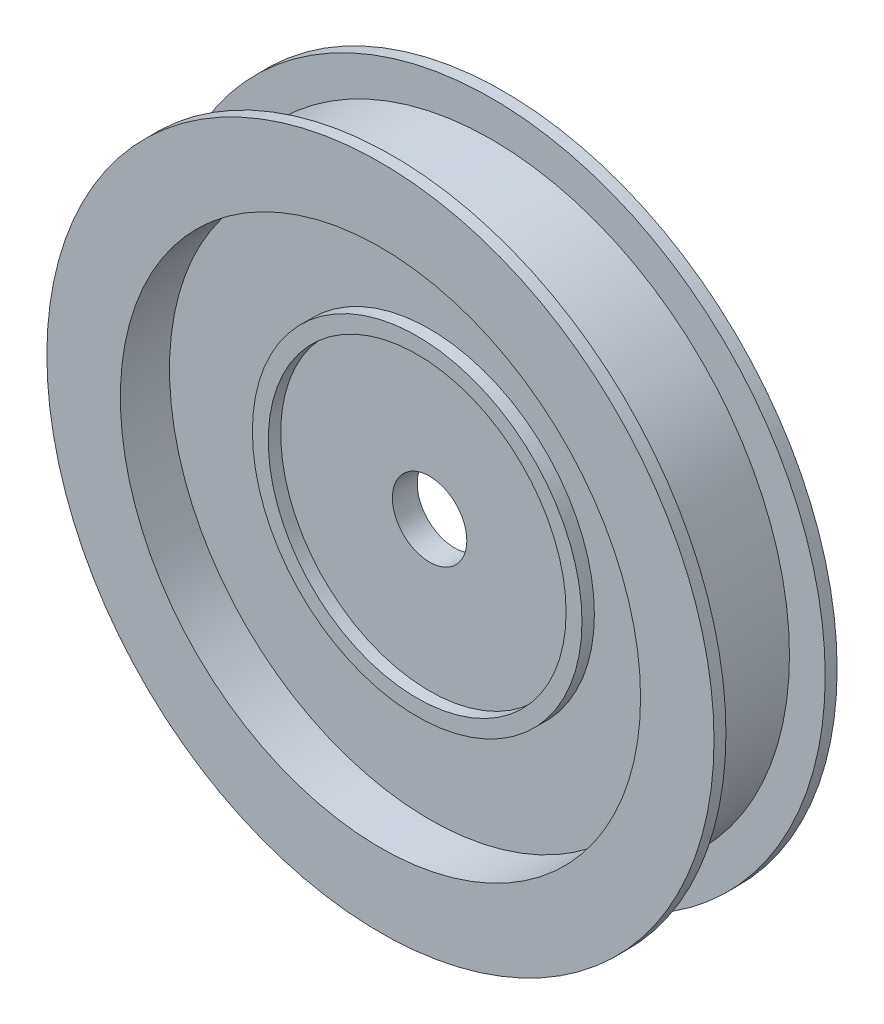
ISO-10303-21;
HEADER;
FILE_DESCRIPTION(('STEP AP214'),'2;1');
FILE_NAME('part.step','',(''),(''),'','','');
FILE_SCHEMA(('AUTOMOTIVE_DESIGN { 1 0 10303 214 1 1 1 1 }'));
ENDSEC;
DATA;
#1=APPLICATION_CONTEXT('core data for automotive mechanical design processes');
#2=APPLICATION_PROTOCOL_DEFINITION('international standard','automotive_design',2000,#1);
#3=PRODUCT_CONTEXT('',#1,'mechanical');
#4=PRODUCT('Part','Part','',(#3));
#5=PRODUCT_RELATED_PRODUCT_CATEGORY('part','',(#4));
#6=PRODUCT_DEFINITION_FORMATION('','',#4);
#7=PRODUCT_DEFINITION_CONTEXT('part definition',#1,'design');
#8=PRODUCT_DEFINITION('design','',#6,#7);
#9=PRODUCT_DEFINITION_SHAPE('','',#8);
#10=(LENGTH_UNIT() NAMED_UNIT(*) SI_UNIT(.MILLI.,.METRE.));
#11=(NAMED_UNIT(*) PLANE_ANGLE_UNIT() SI_UNIT($,.RADIAN.));
#12=(NAMED_UNIT(*) SI_UNIT($,.STERADIAN.) SOLID_ANGLE_UNIT());
#13=UNCERTAINTY_MEASURE_WITH_UNIT(LENGTH_MEASURE(1.E-05),#10,'distance_accuracy_value','');
#14=(GEOMETRIC_REPRESENTATION_CONTEXT(3) GLOBAL_UNCERTAINTY_ASSIGNED_CONTEXT((#13)) GLOBAL_UNIT_ASSIGNED_CONTEXT((#10,
#11,#12)) REPRESENTATION_CONTEXT('',''));
#15=CARTESIAN_POINT('',(0.,0.,0.));
#16=DIRECTION('',(0.,0.,1.));
#17=DIRECTION('',(1.,0.,0.));
#18=AXIS2_PLACEMENT_3D('',#15,#16,#17);
#19=CARTESIAN_POINT('',(0.,0.,0.79375));
#20=DIRECTION('',(0.,0.,1.));
#21=DIRECTION('',(1.,0.,0.));
#22=AXIS2_PLACEMENT_3D('',#19,#20,#21);
#23=PLANE('',#22);
#24=CARTESIAN_POINT('',(0.,0.,0.79375));
#25=DIRECTION('',(0.,0.,1.));
#26=DIRECTION('',(1.,0.,0.));
#27=AXIS2_PLACEMENT_3D('',#24,#25,#26);
#28=CIRCLE('',#27,16.637);
#29=CARTESIAN_POINT('',(16.637,0.,0.79375));
#30=VERTEX_POINT('',#29);
#31=EDGE_CURVE('E43',#30,#30,#28,.F.);
#32=ORIENTED_EDGE('',*,*,#31,.F.);
#33=EDGE_LOOP('',(#32));
#34=FACE_BOUND('',#33,.T.);
#35=CARTESIAN_POINT('',(0.,0.,0.79375));
#36=DIRECTION('',(0.,0.,1.));
#37=DIRECTION('',(1.,0.,0.));
#38=AXIS2_PLACEMENT_3D('',#35,#36,#37);
#39=CIRCLE('',#38,10.541);
#40=CARTESIAN_POINT('',(10.541,0.,0.79375));
#41=VERTEX_POINT('',#40);
#42=EDGE_CURVE('E48',#41,#41,#39,.F.);
#43=ORIENTED_EDGE('',*,*,#42,.T.);
#44=EDGE_LOOP('',(#43));
#45=FACE_BOUND('',#44,.T.);
#46=ADVANCED_FACE('F30',(#34,#45),#23,.T.);
#47=CARTESIAN_POINT('',(0.,0.,-0.79375));
#48=DIRECTION('',(0.,0.,1.));
#49=DIRECTION('',(1.,0.,0.));
#50=AXIS2_PLACEMENT_3D('',#47,#48,#49);
#51=PLANE('',#50);
#52=CARTESIAN_POINT('',(0.,0.,-0.79375));
#53=DIRECTION('',(0.,0.,1.));
#54=DIRECTION('',(1.,0.,0.));
#55=AXIS2_PLACEMENT_3D('',#52,#53,#54);
#56=CIRCLE('',#55,16.637);
#57=CARTESIAN_POINT('',(16.637,0.,-0.79375));
#58=VERTEX_POINT('',#57);
#59=EDGE_CURVE('E55',#58,#58,#56,.F.);
#60=ORIENTED_EDGE('',*,*,#59,.T.);
#61=EDGE_LOOP('',(#60));
#62=FACE_BOUND('',#61,.T.);
#63=CARTESIAN_POINT('',(0.,0.,-0.79375));
#64=DIRECTION('',(0.,0.,1.));
#65=DIRECTION('',(1.,0.,0.));
#66=AXIS2_PLACEMENT_3D('',#63,#64,#65);
#67=CIRCLE('',#66,10.541);
#68=CARTESIAN_POINT('',(10.541,0.,-0.79375));
#69=VERTEX_POINT('',#68);
#70=EDGE_CURVE('E38',#69,#69,#67,.F.);
#71=ORIENTED_EDGE('',*,*,#70,.F.);
#72=EDGE_LOOP('',(#71));
#73=FACE_BOUND('',#72,.T.);
#74=ADVANCED_FACE('F121',(#62,#73),#51,.F.);
#75=CARTESIAN_POINT('',(0.,0.,3.175));
#76=DIRECTION('',(0.,0.,-1.));
#77=DIRECTION('',(-1.,0.,0.));
#78=AXIS2_PLACEMENT_3D('',#75,#76,#77);
#79=CYLINDRICAL_SURFACE('',#78,16.637);
#80=ORIENTED_EDGE('',*,*,#31,.T.);
#81=EDGE_LOOP('',(#80));
#82=FACE_BOUND('',#81,.T.);
#83=CARTESIAN_POINT('',(0.,0.,3.937));
#84=DIRECTION('',(0.,0.,1.));
#85=DIRECTION('',(1.,0.,0.));
#86=AXIS2_PLACEMENT_3D('',#83,#84,#85);
#87=CIRCLE('',#86,16.637);
#88=CARTESIAN_POINT('',(16.637,0.,3.937));
#89=VERTEX_POINT('',#88);
#90=EDGE_CURVE('E82',#89,#89,#87,.T.);
#91=ORIENTED_EDGE('',*,*,#90,.T.);
#92=EDGE_LOOP('',(#91));
#93=FACE_BOUND('',#92,.T.);
#94=ADVANCED_FACE('F108',(#82,#93),#79,.F.);
#95=CARTESIAN_POINT('',(0.,0.,0.79375));
#96=DIRECTION('',(0.,0.,-1.));
#97=DIRECTION('',(-1.,0.,0.));
#98=AXIS2_PLACEMENT_3D('',#95,#96,#97);
#99=CYLINDRICAL_SURFACE('',#98,19.05);
#100=CARTESIAN_POINT('',(0.,0.,-3.175));
#101=DIRECTION('',(0.,0.,-1.));
#102=DIRECTION('',(-1.,0.,0.));
#103=AXIS2_PLACEMENT_3D('',#100,#101,#102);
#104=CIRCLE('',#103,19.05);
#105=CARTESIAN_POINT('',(-19.05,0.,-3.175));
#106=VERTEX_POINT('',#105);
#107=EDGE_CURVE('E87',#106,#106,#104,.T.);
#108=ORIENTED_EDGE('',*,*,#107,.F.);
#109=EDGE_LOOP('',(#108));
#110=FACE_BOUND('',#109,.T.);
#111=CARTESIAN_POINT('',(0.,0.,3.175));
#112=DIRECTION('',(0.,0.,1.));
#113=DIRECTION('',(1.,0.,0.));
#114=AXIS2_PLACEMENT_3D('',#111,#112,#113);
#115=CIRCLE('',#114,19.05);
#116=CARTESIAN_POINT('',(19.05,0.,3.175));
#117=VERTEX_POINT('',#116);
#118=EDGE_CURVE('E51',#117,#117,#115,.T.);
#119=ORIENTED_EDGE('',*,*,#118,.F.);
#120=EDGE_LOOP('',(#119));
#121=FACE_BOUND('',#120,.T.);
#122=ADVANCED_FACE('F32',(#110,#121),#99,.T.);
#123=ORIENTED_EDGE('',*,*,#59,.F.);
#124=EDGE_LOOP('',(#123));
#125=FACE_BOUND('',#124,.T.);
#126=CARTESIAN_POINT('',(0.,0.,-3.937));
#127=DIRECTION('',(0.,0.,1.));
#128=DIRECTION('',(1.,0.,0.));
#129=AXIS2_PLACEMENT_3D('',#126,#127,#128);
#130=CIRCLE('',#129,16.637);
#131=CARTESIAN_POINT('',(16.637,0.,-3.937));
#132=VERTEX_POINT('',#131);
#133=EDGE_CURVE('E94',#132,#132,#130,.T.);
#134=ORIENTED_EDGE('',*,*,#133,.F.);
#135=EDGE_LOOP('',(#134));
#136=FACE_BOUND('',#135,.T.);
#137=ADVANCED_FACE('F103',(#125,#136),#79,.F.);
#138=CARTESIAN_POINT('',(0.,0.,1.5875));
#139=DIRECTION('',(0.,0.,-1.));
#140=DIRECTION('',(-1.,0.,0.));
#141=AXIS2_PLACEMENT_3D('',#138,#139,#140);
#142=CYLINDRICAL_SURFACE('',#141,10.541);
#143=CARTESIAN_POINT('',(0.,0.,-1.5875));
#144=DIRECTION('',(0.,0.,1.));
#145=DIRECTION('',(1.,0.,0.));
#146=AXIS2_PLACEMENT_3D('',#143,#144,#145);
#147=CIRCLE('',#146,10.541);
#148=CARTESIAN_POINT('',(10.541,0.,-1.5875));
#149=VERTEX_POINT('',#148);
#150=EDGE_CURVE('E46',#149,#149,#147,.T.);
#151=ORIENTED_EDGE('',*,*,#150,.T.);
#152=EDGE_LOOP('',(#151));
#153=FACE_BOUND('',#152,.T.);
#154=ORIENTED_EDGE('',*,*,#70,.T.);
#155=EDGE_LOOP('',(#154));
#156=FACE_BOUND('',#155,.T.);
#157=ADVANCED_FACE('F105',(#153,#156),#142,.T.);
#158=CARTESIAN_POINT('',(0.,0.,-1.5875));
#159=DIRECTION('',(0.,0.,1.));
#160=DIRECTION('',(1.,0.,0.));
#161=AXIS2_PLACEMENT_3D('',#158,#159,#160);
#162=PLANE('',#161);
#163=ORIENTED_EDGE('',*,*,#150,.F.);
#164=EDGE_LOOP('',(#163));
#165=FACE_BOUND('',#164,.T.);
#166=CARTESIAN_POINT('',(0.,0.,-1.5875));
#167=DIRECTION('',(0.,0.,1.));
#168=DIRECTION('',(1.,0.,0.));
#169=AXIS2_PLACEMENT_3D('',#166,#167,#168);
#170=CIRCLE('',#169,9.525);
#171=CARTESIAN_POINT('',(9.525,0.,-1.5875));
#172=VERTEX_POINT('',#171);
#173=EDGE_CURVE('E70',#172,#172,#170,.T.);
#174=ORIENTED_EDGE('',*,*,#173,.T.);
#175=EDGE_LOOP('',(#174));
#176=FACE_BOUND('',#175,.T.);
#177=ADVANCED_FACE('F113',(#165,#176),#162,.F.);
#178=CARTESIAN_POINT('',(0.,0.,1.5875));
#179=DIRECTION('',(0.,0.,-1.));
#180=DIRECTION('',(-1.,0.,0.));
#181=AXIS2_PLACEMENT_3D('',#178,#179,#180);
#182=CYLINDRICAL_SURFACE('',#181,9.525);
#183=ORIENTED_EDGE('',*,*,#173,.F.);
#184=EDGE_LOOP('',(#183));
#185=FACE_BOUND('',#184,.T.);
#186=CARTESIAN_POINT('',(0.,0.,-0.79375));
#187=DIRECTION('',(0.,0.,1.));
#188=DIRECTION('',(1.,0.,0.));
#189=AXIS2_PLACEMENT_3D('',#186,#187,#188);
#190=CIRCLE('',#189,9.525);
#191=CARTESIAN_POINT('',(9.525,0.,-0.79375));
#192=VERTEX_POINT('',#191);
#193=EDGE_CURVE('E52',#192,#192,#190,.F.);
#194=ORIENTED_EDGE('',*,*,#193,.F.);
#195=EDGE_LOOP('',(#194));
#196=FACE_BOUND('',#195,.T.);
#197=ADVANCED_FACE('F143',(#185,#196),#182,.F.);
#198=CARTESIAN_POINT('',(0.,0.,1.5875));
#199=DIRECTION('',(0.,0.,1.));
#200=DIRECTION('',(1.,0.,0.));
#201=AXIS2_PLACEMENT_3D('',#198,#199,#200);
#202=PLANE('',#201);
#203=CARTESIAN_POINT('',(0.,0.,1.5875));
#204=DIRECTION('',(0.,0.,1.));
#205=DIRECTION('',(1.,0.,0.));
#206=AXIS2_PLACEMENT_3D('',#203,#204,#205);
#207=CIRCLE('',#206,10.541);
#208=CARTESIAN_POINT('',(10.541,0.,1.5875));
#209=VERTEX_POINT('',#208);
#210=EDGE_CURVE('E61',#209,#209,#207,.T.);
#211=ORIENTED_EDGE('',*,*,#210,.T.);
#212=EDGE_LOOP('',(#211));
#213=FACE_BOUND('',#212,.T.);
#214=CARTESIAN_POINT('',(0.,0.,1.5875));
#215=DIRECTION('',(0.,0.,1.));
#216=DIRECTION('',(1.,0.,0.));
#217=AXIS2_PLACEMENT_3D('',#214,#215,#216);
#218=CIRCLE('',#217,9.525);
#219=CARTESIAN_POINT('',(9.525,0.,1.5875));
#220=VERTEX_POINT('',#219);
#221=EDGE_CURVE('E68',#220,#220,#218,.T.);
#222=ORIENTED_EDGE('',*,*,#221,.F.);
#223=EDGE_LOOP('',(#222));
#224=FACE_BOUND('',#223,.T.);
#225=ADVANCED_FACE('F162',(#213,#224),#202,.T.);
#226=ORIENTED_EDGE('',*,*,#42,.F.);
#227=EDGE_LOOP('',(#226));
#228=FACE_BOUND('',#227,.T.);
#229=ORIENTED_EDGE('',*,*,#210,.F.);
#230=EDGE_LOOP('',(#229));
#231=FACE_BOUND('',#230,.T.);
#232=ADVANCED_FACE('F116',(#228,#231),#142,.T.);
#233=CARTESIAN_POINT('',(0.,0.,0.79375));
#234=DIRECTION('',(0.,0.,1.));
#235=DIRECTION('',(1.,0.,0.));
#236=AXIS2_PLACEMENT_3D('',#233,#234,#235);
#237=CIRCLE('',#236,9.525);
#238=CARTESIAN_POINT('',(9.525,0.,0.79375));
#239=VERTEX_POINT('',#238);
#240=EDGE_CURVE('E10',#239,#239,#237,.F.);
#241=ORIENTED_EDGE('',*,*,#240,.T.);
#242=EDGE_LOOP('',(#241));
#243=FACE_BOUND('',#242,.T.);
#244=ORIENTED_EDGE('',*,*,#221,.T.);
#245=EDGE_LOOP('',(#244));
#246=FACE_BOUND('',#245,.T.);
#247=ADVANCED_FACE('F134',(#243,#246),#182,.F.);
#248=CARTESIAN_POINT('',(0.,0.,0.79375));
#249=DIRECTION('',(0.,0.,1.));
#250=DIRECTION('',(1.,0.,0.));
#251=AXIS2_PLACEMENT_3D('',#248,#249,#250);
#252=CIRCLE('',#251,2.38125);
#253=CARTESIAN_POINT('',(2.38125,0.,0.79375));
#254=VERTEX_POINT('',#253);
#255=EDGE_CURVE('E75',#254,#254,#252,.T.);
#256=ORIENTED_EDGE('',*,*,#255,.F.);
#257=EDGE_LOOP('',(#256));
#258=FACE_BOUND('',#257,.T.);
#259=ORIENTED_EDGE('',*,*,#240,.F.);
#260=EDGE_LOOP('',(#259));
#261=FACE_BOUND('',#260,.T.);
#262=ADVANCED_FACE('F125',(#258,#261),#23,.T.);
#263=CARTESIAN_POINT('',(0.,0.,-0.79375));
#264=DIRECTION('',(0.,0.,1.));
#265=DIRECTION('',(1.,0.,0.));
#266=AXIS2_PLACEMENT_3D('',#263,#264,#265);
#267=CIRCLE('',#266,2.38125);
#268=CARTESIAN_POINT('',(2.38125,0.,-0.79375));
#269=VERTEX_POINT('',#268);
#270=EDGE_CURVE('E34',#269,#269,#267,.T.);
#271=ORIENTED_EDGE('',*,*,#270,.T.);
#272=EDGE_LOOP('',(#271));
#273=FACE_BOUND('',#272,.T.);
#274=ORIENTED_EDGE('',*,*,#193,.T.);
#275=EDGE_LOOP('',(#274));
#276=FACE_BOUND('',#275,.T.);
#277=ADVANCED_FACE('F130',(#273,#276),#51,.F.);
#278=CARTESIAN_POINT('',(0.,0.,-3.175));
#279=DIRECTION('',(0.,0.,1.));
#280=DIRECTION('',(1.,0.,0.));
#281=AXIS2_PLACEMENT_3D('',#278,#279,#280);
#282=CYLINDRICAL_SURFACE('',#281,2.38125);
#283=ORIENTED_EDGE('',*,*,#255,.T.);
#284=EDGE_LOOP('',(#283));
#285=FACE_BOUND('',#284,.T.);
#286=ORIENTED_EDGE('',*,*,#270,.F.);
#287=EDGE_LOOP('',(#286));
#288=FACE_BOUND('',#287,.T.);
#289=ADVANCED_FACE('F140',(#285,#288),#282,.F.);
#290=CARTESIAN_POINT('',(0.,0.,3.175));
#291=DIRECTION('',(0.,0.,1.));
#292=DIRECTION('',(1.,0.,0.));
#293=AXIS2_PLACEMENT_3D('',#290,#291,#292);
#294=PLANE('',#293);
#295=CARTESIAN_POINT('',(0.,0.,3.175));
#296=DIRECTION('',(0.,0.,1.));
#297=DIRECTION('',(1.,0.,0.));
#298=AXIS2_PLACEMENT_3D('',#295,#296,#297);
#299=CIRCLE('',#298,21.336);
#300=CARTESIAN_POINT('',(-21.336,0.,3.175));
#301=VERTEX_POINT('',#300);
#302=EDGE_CURVE('E79',#301,#301,#299,.T.);
#303=ORIENTED_EDGE('',*,*,#302,.F.);
#304=EDGE_LOOP('',(#303));
#305=FACE_BOUND('',#304,.T.);
#306=ORIENTED_EDGE('',*,*,#118,.T.);
#307=EDGE_LOOP('',(#306));
#308=FACE_BOUND('',#307,.T.);
#309=ADVANCED_FACE('F149',(#305,#308),#294,.F.);
#310=CARTESIAN_POINT('',(0.,0.,3.937));
#311=DIRECTION('',(0.,0.,1.));
#312=DIRECTION('',(1.,0.,0.));
#313=AXIS2_PLACEMENT_3D('',#310,#311,#312);
#314=PLANE('',#313);
#315=CARTESIAN_POINT('',(0.,0.,3.937));
#316=DIRECTION('',(0.,0.,1.));
#317=DIRECTION('',(1.,0.,0.));
#318=AXIS2_PLACEMENT_3D('',#315,#316,#317);
#319=CIRCLE('',#318,21.336);
#320=CARTESIAN_POINT('',(-21.336,0.,3.937));
#321=VERTEX_POINT('',#320);
#322=EDGE_CURVE('E78',#321,#321,#319,.T.);
#323=ORIENTED_EDGE('',*,*,#322,.T.);
#324=EDGE_LOOP('',(#323));
#325=FACE_BOUND('',#324,.T.);
#326=ORIENTED_EDGE('',*,*,#90,.F.);
#327=EDGE_LOOP('',(#326));
#328=FACE_BOUND('',#327,.T.);
#329=ADVANCED_FACE('F156',(#325,#328),#314,.T.);
#330=CARTESIAN_POINT('',(0.,0.,3.937));
#331=DIRECTION('',(0.,0.,-1.));
#332=DIRECTION('',(-1.,0.,0.));
#333=AXIS2_PLACEMENT_3D('',#330,#331,#332);
#334=CYLINDRICAL_SURFACE('',#333,21.336);
#335=CARTESIAN_POINT('',(-21.336,0.,3.937));
#336=CARTESIAN_POINT('',(-21.336,0.,3.9290625));
#337=CARTESIAN_POINT('',(-21.336,0.,3.921125));
#338=CARTESIAN_POINT('',(-21.336,0.,3.90525));
#339=CARTESIAN_POINT('',(-21.336,0.,3.8973125));
#340=CARTESIAN_POINT('',(-21.336,0.,3.8814375));
#341=CARTESIAN_POINT('',(-21.336,0.,3.8735));
#342=CARTESIAN_POINT('',(-21.336,0.,3.857625));
#343=CARTESIAN_POINT('',(-21.336,0.,3.8496875));
#344=CARTESIAN_POINT('',(-21.336,0.,3.8338125));
#345=CARTESIAN_POINT('',(-21.336,0.,3.825875));
#346=CARTESIAN_POINT('',(-21.336,0.,3.81));
#347=CARTESIAN_POINT('',(-21.336,0.,3.8020625));
#348=CARTESIAN_POINT('',(-21.336,0.,3.7861875));
#349=CARTESIAN_POINT('',(-21.336,0.,3.77825));
#350=CARTESIAN_POINT('',(-21.336,0.,3.762375));
#351=CARTESIAN_POINT('',(-21.336,0.,3.7544375));
#352=CARTESIAN_POINT('',(-21.336,0.,3.7385625));
#353=CARTESIAN_POINT('',(-21.336,0.,3.730625));
#354=CARTESIAN_POINT('',(-21.336,0.,3.71475));
#355=CARTESIAN_POINT('',(-21.336,0.,3.7068125));
#356=CARTESIAN_POINT('',(-21.336,0.,3.6909375));
#357=CARTESIAN_POINT('',(-21.336,0.,3.683));
#358=CARTESIAN_POINT('',(-21.336,0.,3.667125));
#359=CARTESIAN_POINT('',(-21.336,0.,3.6591875));
#360=CARTESIAN_POINT('',(-21.336,0.,3.6433125));
#361=CARTESIAN_POINT('',(-21.336,0.,3.635375));
#362=CARTESIAN_POINT('',(-21.336,0.,3.6195));
#363=CARTESIAN_POINT('',(-21.336,0.,3.6115625));
#364=CARTESIAN_POINT('',(-21.336,0.,3.5956875));
#365=CARTESIAN_POINT('',(-21.336,0.,3.58775));
#366=CARTESIAN_POINT('',(-21.336,0.,3.571875));
#367=CARTESIAN_POINT('',(-21.336,0.,3.5639375));
#368=CARTESIAN_POINT('',(-21.336,0.,3.5480625));
#369=CARTESIAN_POINT('',(-21.336,0.,3.540125));
#370=CARTESIAN_POINT('',(-21.336,0.,3.52425));
#371=CARTESIAN_POINT('',(-21.336,0.,3.5163125));
#372=CARTESIAN_POINT('',(-21.336,0.,3.5004375));
#373=CARTESIAN_POINT('',(-21.336,0.,3.4925));
#374=CARTESIAN_POINT('',(-21.336,0.,3.476625));
#375=CARTESIAN_POINT('',(-21.336,0.,3.4686875));
#376=CARTESIAN_POINT('',(-21.336,0.,3.4528125));
#377=CARTESIAN_POINT('',(-21.336,0.,3.444875));
#378=CARTESIAN_POINT('',(-21.336,0.,3.429));
#379=CARTESIAN_POINT('',(-21.336,0.,3.4210625));
#380=CARTESIAN_POINT('',(-21.336,0.,3.4051875));
#381=CARTESIAN_POINT('',(-21.336,0.,3.39725));
#382=CARTESIAN_POINT('',(-21.336,0.,3.381375));
#383=CARTESIAN_POINT('',(-21.336,0.,3.3734375));
#384=CARTESIAN_POINT('',(-21.336,0.,3.3575625));
#385=CARTESIAN_POINT('',(-21.336,0.,3.349625));
#386=CARTESIAN_POINT('',(-21.336,0.,3.33375));
#387=CARTESIAN_POINT('',(-21.336,0.,3.3258125));
#388=CARTESIAN_POINT('',(-21.336,0.,3.3099375));
#389=CARTESIAN_POINT('',(-21.336,0.,3.302));
#390=CARTESIAN_POINT('',(-21.336,0.,3.286125));
#391=CARTESIAN_POINT('',(-21.336,0.,3.2781875));
#392=CARTESIAN_POINT('',(-21.336,0.,3.2623125));
#393=CARTESIAN_POINT('',(-21.336,0.,3.254375));
#394=CARTESIAN_POINT('',(-21.336,0.,3.2385));
#395=CARTESIAN_POINT('',(-21.336,0.,3.2305625));
#396=CARTESIAN_POINT('',(-21.336,0.,3.2146875));
#397=CARTESIAN_POINT('',(-21.336,0.,3.20675));
#398=CARTESIAN_POINT('',(-21.336,0.,3.190875));
#399=CARTESIAN_POINT('',(-21.336,0.,3.1829375));
#400=CARTESIAN_POINT('',(-21.336,0.,3.175));
#401=B_SPLINE_CURVE_WITH_KNOTS('',3,(#335,#336,#337,#338,#339,#340,#341,#342,#343,#344,#345,
#346,#347,#348,#349,#350,#351,#352,#353,#354,#355,#356,#357,#358,#359,#360,#361,#362,#363,#364,
#365,#366,#367,#368,#369,#370,#371,#372,#373,#374,#375,#376,#377,#378,#379,#380,#381,#382,#383,
#384,#385,#386,#387,#388,#389,#390,#391,#392,#393,#394,#395,#396,#397,#398,#399,#400),
.UNSPECIFIED.,.F.,.F.,(4,2,2,2,2,2,2,2,2,2,2,2,2,2,2,2,2,2,2,2,2,2,2,2,2,2,2,2,2,2,2,2,4),(0.,
0.0238125000000004,0.0476250000000004,0.0714375000000003,0.0952500000000003,0.1190625,0.142875,
0.1666875,0.1905,0.2143125,0.238125,0.2619375,0.28575,0.3095625,0.333375,0.3571875,0.381,
0.4048125,0.428625,0.4524375,0.47625,0.5000625,0.523875,0.5476875,0.5715,0.5953125,0.619125,
0.6429375,0.66675,0.6905625,0.714375,0.7381875,0.762),.UNSPECIFIED.);
#402=EDGE_CURVE('BSEAM160',#321,#301,#401,.T.);
#403=ORIENTED_EDGE('',*,*,#322,.F.);
#404=ORIENTED_EDGE('',*,*,#302,.T.);
#405=ORIENTED_EDGE('',*,*,#402,.T.);
#406=ORIENTED_EDGE('',*,*,#402,.F.);
#407=EDGE_LOOP('',(#403,#405,#404,#406));
#408=FACE_BOUND('',#407,.T.);
#409=ADVANCED_FACE('F160',(#408),#334,.T.);
#410=CARTESIAN_POINT('',(0.,0.,-3.175));
#411=DIRECTION('',(0.,0.,-1.));
#412=DIRECTION('',(1.,0.,0.));
#413=AXIS2_PLACEMENT_3D('',#410,#411,#412);
#414=PLANE('',#413);
#415=CARTESIAN_POINT('',(0.,0.,-3.175));
#416=DIRECTION('',(0.,0.,1.));
#417=DIRECTION('',(1.,0.,0.));
#418=AXIS2_PLACEMENT_3D('',#415,#416,#417);
#419=CIRCLE('',#418,21.336);
#420=CARTESIAN_POINT('',(21.336,0.,-3.175));
#421=VERTEX_POINT('',#420);
#422=EDGE_CURVE('E91',#421,#421,#419,.T.);
#423=ORIENTED_EDGE('',*,*,#422,.T.);
#424=EDGE_LOOP('',(#423));
#425=FACE_BOUND('',#424,.T.);
#426=ORIENTED_EDGE('',*,*,#107,.T.);
#427=EDGE_LOOP('',(#426));
#428=FACE_BOUND('',#427,.T.);
#429=ADVANCED_FACE('F225',(#425,#428),#414,.F.);
#430=CARTESIAN_POINT('',(0.,0.,-3.937));
#431=DIRECTION('',(0.,0.,1.));
#432=DIRECTION('',(1.,0.,0.));
#433=AXIS2_PLACEMENT_3D('',#430,#431,#432);
#434=CYLINDRICAL_SURFACE('',#433,21.336);
#435=CARTESIAN_POINT('',(0.,0.,-3.937));
#436=DIRECTION('',(0.,0.,1.));
#437=DIRECTION('',(1.,0.,0.));
#438=AXIS2_PLACEMENT_3D('',#435,#436,#437);
#439=CIRCLE('',#438,21.336);
#440=CARTESIAN_POINT('',(21.336,0.,-3.937));
#441=VERTEX_POINT('',#440);
#442=EDGE_CURVE('E90',#441,#441,#439,.T.);
#443=CARTESIAN_POINT('',(21.336,0.,-3.937));
#444=CARTESIAN_POINT('',(21.336,0.,-3.9290625));
#445=CARTESIAN_POINT('',(21.336,0.,-3.921125));
#446=CARTESIAN_POINT('',(21.336,0.,-3.90525));
#447=CARTESIAN_POINT('',(21.336,0.,-3.8973125));
#448=CARTESIAN_POINT('',(21.336,0.,-3.8814375));
#449=CARTESIAN_POINT('',(21.336,0.,-3.8735));
#450=CARTESIAN_POINT('',(21.336,0.,-3.857625));
#451=CARTESIAN_POINT('',(21.336,0.,-3.8496875));
#452=CARTESIAN_POINT('',(21.336,0.,-3.8338125));
#453=CARTESIAN_POINT('',(21.336,0.,-3.825875));
#454=CARTESIAN_POINT('',(21.336,0.,-3.81));
#455=CARTESIAN_POINT('',(21.336,0.,-3.8020625));
#456=CARTESIAN_POINT('',(21.336,0.,-3.7861875));
#457=CARTESIAN_POINT('',(21.336,0.,-3.77825));
#458=CARTESIAN_POINT('',(21.336,0.,-3.762375));
#459=CARTESIAN_POINT('',(21.336,0.,-3.7544375));
#460=CARTESIAN_POINT('',(21.336,0.,-3.7385625));
#461=CARTESIAN_POINT('',(21.336,0.,-3.730625));
#462=CARTESIAN_POINT('',(21.336,0.,-3.71475));
#463=CARTESIAN_POINT('',(21.336,0.,-3.7068125));
#464=CARTESIAN_POINT('',(21.336,0.,-3.6909375));
#465=CARTESIAN_POINT('',(21.336,0.,-3.683));
#466=CARTESIAN_POINT('',(21.336,0.,-3.667125));
#467=CARTESIAN_POINT('',(21.336,0.,-3.6591875));
#468=CARTESIAN_POINT('',(21.336,0.,-3.6433125));
#469=CARTESIAN_POINT('',(21.336,0.,-3.635375));
#470=CARTESIAN_POINT('',(21.336,0.,-3.6195));
#471=CARTESIAN_POINT('',(21.336,0.,-3.6115625));
#472=CARTESIAN_POINT('',(21.336,0.,-3.5956875));
#473=CARTESIAN_POINT('',(21.336,0.,-3.58775));
#474=CARTESIAN_POINT('',(21.336,0.,-3.571875));
#475=CARTESIAN_POINT('',(21.336,0.,-3.5639375));
#476=CARTESIAN_POINT('',(21.336,0.,-3.5480625));
#477=CARTESIAN_POINT('',(21.336,0.,-3.540125));
#478=CARTESIAN_POINT('',(21.336,0.,-3.52425));
#479=CARTESIAN_POINT('',(21.336,0.,-3.5163125));
#480=CARTESIAN_POINT('',(21.336,0.,-3.5004375));
#481=CARTESIAN_POINT('',(21.336,0.,-3.4925));
#482=CARTESIAN_POINT('',(21.336,0.,-3.476625));
#483=CARTESIAN_POINT('',(21.336,0.,-3.4686875));
#484=CARTESIAN_POINT('',(21.336,0.,-3.4528125));
#485=CARTESIAN_POINT('',(21.336,0.,-3.444875));
#486=CARTESIAN_POINT('',(21.336,0.,-3.429));
#487=CARTESIAN_POINT('',(21.336,0.,-3.4210625));
#488=CARTESIAN_POINT('',(21.336,0.,-3.4051875));
#489=CARTESIAN_POINT('',(21.336,0.,-3.39725));
#490=CARTESIAN_POINT('',(21.336,0.,-3.381375));
#491=CARTESIAN_POINT('',(21.336,0.,-3.3734375));
#492=CARTESIAN_POINT('',(21.336,0.,-3.3575625));
#493=CARTESIAN_POINT('',(21.336,0.,-3.349625));
#494=CARTESIAN_POINT('',(21.336,0.,-3.33375));
#495=CARTESIAN_POINT('',(21.336,0.,-3.3258125));
#496=CARTESIAN_POINT('',(21.336,0.,-3.3099375));
#497=CARTESIAN_POINT('',(21.336,0.,-3.302));
#498=CARTESIAN_POINT('',(21.336,0.,-3.286125));
#499=CARTESIAN_POINT('',(21.336,0.,-3.2781875));
#500=CARTESIAN_POINT('',(21.336,0.,-3.2623125));
#501=CARTESIAN_POINT('',(21.336,0.,-3.254375));
#502=CARTESIAN_POINT('',(21.336,0.,-3.2385));
#503=CARTESIAN_POINT('',(21.336,0.,-3.2305625));
#504=CARTESIAN_POINT('',(21.336,0.,-3.2146875));
#505=CARTESIAN_POINT('',(21.336,0.,-3.20675));
#506=CARTESIAN_POINT('',(21.336,0.,-3.190875));
#507=CARTESIAN_POINT('',(21.336,0.,-3.1829375));
#508=CARTESIAN_POINT('',(21.336,0.,-3.175));
#509=B_SPLINE_CURVE_WITH_KNOTS('',3,(#443,#444,#445,#446,#447,#448,#449,#450,#451,#452,#453,
#454,#455,#456,#457,#458,#459,#460,#461,#462,#463,#464,#465,#466,#467,#468,#469,#470,#471,#472,
#473,#474,#475,#476,#477,#478,#479,#480,#481,#482,#483,#484,#485,#486,#487,#488,#489,#490,#491,
#492,#493,#494,#495,#496,#497,#498,#499,#500,#501,#502,#503,#504,#505,#506,#507,#508),
.UNSPECIFIED.,.F.,.F.,(4,2,2,2,2,2,2,2,2,2,2,2,2,2,2,2,2,2,2,2,2,2,2,2,2,2,2,2,2,2,2,2,4),(0.,
0.0238125000000004,0.0476250000000004,0.0714375000000003,0.0952500000000003,0.1190625,0.142875,
0.1666875,0.190500000000001,0.214312500000001,0.238125,0.2619375,0.28575,0.3095625,0.333375,
0.3571875,0.381,0.4048125,0.428625,0.4524375,0.47625,0.500062500000001,0.523875,0.5476875,
0.5715,0.5953125,0.619125,0.6429375,0.66675,0.6905625,0.714375,0.7381875,0.762),.UNSPECIFIED.);
#510=EDGE_CURVE('BSEAM240',#441,#421,#509,.T.);
#511=ORIENTED_EDGE('',*,*,#442,.T.);
#512=ORIENTED_EDGE('',*,*,#422,.F.);
#513=ORIENTED_EDGE('',*,*,#510,.T.);
#514=ORIENTED_EDGE('',*,*,#510,.F.);
#515=EDGE_LOOP('',(#511,#513,#512,#514));
#516=FACE_BOUND('',#515,.T.);
#517=ADVANCED_FACE('F240',(#516),#434,.T.);
#518=CARTESIAN_POINT('',(0.,0.,-3.937));
#519=DIRECTION('',(0.,0.,-1.));
#520=DIRECTION('',(1.,0.,0.));
#521=AXIS2_PLACEMENT_3D('',#518,#519,#520);
#522=PLANE('',#521);
#523=ORIENTED_EDGE('',*,*,#133,.T.);
#524=EDGE_LOOP('',(#523));
#525=FACE_BOUND('',#524,.T.);
#526=ORIENTED_EDGE('',*,*,#442,.F.);
#527=EDGE_LOOP('',(#526));
#528=FACE_BOUND('',#527,.T.);
#529=ADVANCED_FACE('F100',(#525,#528),#522,.T.);
#530=CLOSED_SHELL('',(#46,#74,#94,#122,#137,#157,#177,#197,#225,#232,#247,#262,#277,#289,#309,
#329,#409,#429,#517,#529));
#531=MANIFOLD_SOLID_BREP('B2',#530);
#532=ADVANCED_BREP_SHAPE_REPRESENTATION('',(#18,#531),#14);
#533=SHAPE_DEFINITION_REPRESENTATION(#9,#532);
ENDSEC;
END-ISO-10303-21;
